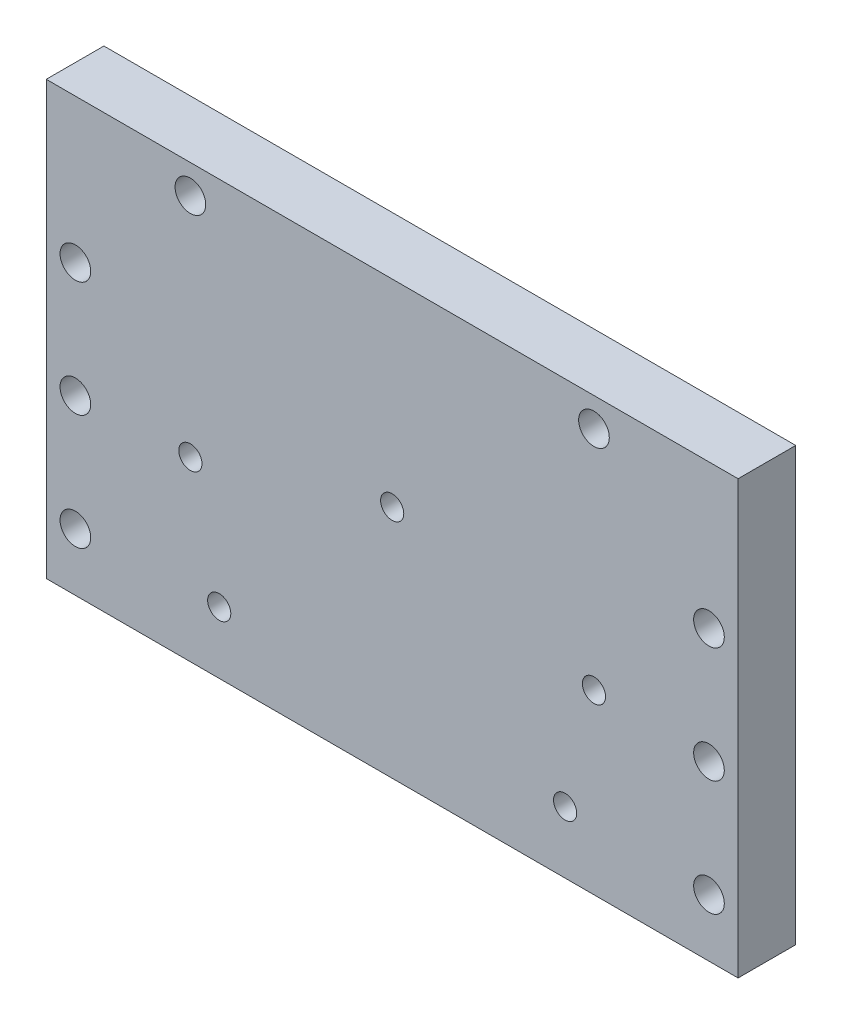
ISO-10303-21;
HEADER;
FILE_DESCRIPTION(('STEP AP214'),'2;1');
FILE_NAME('part.step','',(''),(''),'','','');
FILE_SCHEMA(('AUTOMOTIVE_DESIGN { 1 0 10303 214 1 1 1 1 }'));
ENDSEC;
DATA;
#1=APPLICATION_CONTEXT('core data for automotive mechanical design processes');
#2=APPLICATION_PROTOCOL_DEFINITION('international standard','automotive_design',2000,#1);
#3=PRODUCT_CONTEXT('',#1,'mechanical');
#4=PRODUCT('Part','Part','',(#3));
#5=PRODUCT_RELATED_PRODUCT_CATEGORY('part','',(#4));
#6=PRODUCT_DEFINITION_FORMATION('','',#4);
#7=PRODUCT_DEFINITION_CONTEXT('part definition',#1,'design');
#8=PRODUCT_DEFINITION('design','',#6,#7);
#9=PRODUCT_DEFINITION_SHAPE('','',#8);
#10=(LENGTH_UNIT() NAMED_UNIT(*) SI_UNIT(.MILLI.,.METRE.));
#11=(NAMED_UNIT(*) PLANE_ANGLE_UNIT() SI_UNIT($,.RADIAN.));
#12=(NAMED_UNIT(*) SI_UNIT($,.STERADIAN.) SOLID_ANGLE_UNIT());
#13=UNCERTAINTY_MEASURE_WITH_UNIT(LENGTH_MEASURE(1.E-05),#10,'distance_accuracy_value','');
#14=(GEOMETRIC_REPRESENTATION_CONTEXT(3) GLOBAL_UNCERTAINTY_ASSIGNED_CONTEXT((#13)) GLOBAL_UNIT_ASSIGNED_CONTEXT((#10,
#11,#12)) REPRESENTATION_CONTEXT('',''));
#15=CARTESIAN_POINT('',(0.,0.,0.));
#16=DIRECTION('',(0.,0.,1.));
#17=DIRECTION('',(1.,0.,0.));
#18=AXIS2_PLACEMENT_3D('',#15,#16,#17);
#19=CARTESIAN_POINT('',(76.2,47.625,6.35));
#20=DIRECTION('',(-1.,0.,0.));
#21=DIRECTION('',(0.,0.,1.));
#22=AXIS2_PLACEMENT_3D('',#19,#20,#21);
#23=PLANE('',#22);
#24=DIRECTION('',(0.,1.,0.));
#25=VECTOR('',#24,1.);
#26=CARTESIAN_POINT('',(76.2,47.625,-6.35));
#27=LINE('',#26,#25);
#28=CARTESIAN_POINT('',(76.2,-47.625,-6.35));
#29=VERTEX_POINT('',#28);
#30=CARTESIAN_POINT('',(76.2,47.625,-6.35));
#31=VERTEX_POINT('',#30);
#32=EDGE_CURVE('E104',#29,#31,#27,.T.);
#33=ORIENTED_EDGE('',*,*,#32,.T.);
#34=DIRECTION('',(0.,0.,-1.));
#35=VECTOR('',#34,1.);
#36=CARTESIAN_POINT('',(76.2,47.625,6.35));
#37=LINE('',#36,#35);
#38=CARTESIAN_POINT('',(76.2,47.625,6.35));
#39=VERTEX_POINT('',#38);
#40=EDGE_CURVE('E11',#39,#31,#37,.T.);
#41=ORIENTED_EDGE('',*,*,#40,.F.);
#42=DIRECTION('',(0.,1.,0.));
#43=VECTOR('',#42,1.);
#44=CARTESIAN_POINT('',(76.2,47.625,6.35));
#45=LINE('',#44,#43);
#46=CARTESIAN_POINT('',(76.2,-47.625,6.35));
#47=VERTEX_POINT('',#46);
#48=EDGE_CURVE('E92',#47,#39,#45,.T.);
#49=ORIENTED_EDGE('',*,*,#48,.F.);
#50=DIRECTION('',(0.,0.,-1.));
#51=VECTOR('',#50,1.);
#52=CARTESIAN_POINT('',(76.2,-47.625,6.35));
#53=LINE('',#52,#51);
#54=EDGE_CURVE('E100',#47,#29,#53,.T.);
#55=ORIENTED_EDGE('',*,*,#54,.T.);
#56=EDGE_LOOP('',(#33,#41,#49,#55));
#57=FACE_BOUND('',#56,.T.);
#58=ADVANCED_FACE('F41',(#57),#23,.F.);
#59=CARTESIAN_POINT('',(-76.2,47.625,6.35));
#60=DIRECTION('',(0.,-1.,0.));
#61=DIRECTION('',(0.,0.,-1.));
#62=AXIS2_PLACEMENT_3D('',#59,#60,#61);
#63=PLANE('',#62);
#64=DIRECTION('',(-1.,0.,0.));
#65=VECTOR('',#64,1.);
#66=CARTESIAN_POINT('',(-76.2,47.625,-6.35));
#67=LINE('',#66,#65);
#68=CARTESIAN_POINT('',(-76.2,47.625,-6.35));
#69=VERTEX_POINT('',#68);
#70=EDGE_CURVE('E96',#31,#69,#67,.T.);
#71=ORIENTED_EDGE('',*,*,#70,.T.);
#72=DIRECTION('',(0.,0.,-1.));
#73=VECTOR('',#72,1.);
#74=CARTESIAN_POINT('',(-76.2,47.625,6.35));
#75=LINE('',#74,#73);
#76=CARTESIAN_POINT('',(-76.2,47.625,6.35));
#77=VERTEX_POINT('',#76);
#78=EDGE_CURVE('E49',#77,#69,#75,.T.);
#79=ORIENTED_EDGE('',*,*,#78,.F.);
#80=DIRECTION('',(-1.,0.,0.));
#81=VECTOR('',#80,1.);
#82=CARTESIAN_POINT('',(-76.2,47.625,6.35));
#83=LINE('',#82,#81);
#84=EDGE_CURVE('E87',#39,#77,#83,.T.);
#85=ORIENTED_EDGE('',*,*,#84,.F.);
#86=ORIENTED_EDGE('',*,*,#40,.T.);
#87=EDGE_LOOP('',(#71,#79,#85,#86));
#88=FACE_BOUND('',#87,.T.);
#89=ADVANCED_FACE('F95',(#88),#63,.F.);
#90=CARTESIAN_POINT('',(-76.2,47.625,6.35));
#91=DIRECTION('',(1.,0.,0.));
#92=DIRECTION('',(0.,0.,-1.));
#93=AXIS2_PLACEMENT_3D('',#90,#91,#92);
#94=PLANE('',#93);
#95=DIRECTION('',(0.,-1.,0.));
#96=VECTOR('',#95,1.);
#97=CARTESIAN_POINT('',(-76.2,47.625,-6.35));
#98=LINE('',#97,#96);
#99=CARTESIAN_POINT('',(-76.2,-47.625,-6.35));
#100=VERTEX_POINT('',#99);
#101=EDGE_CURVE('E74',#69,#100,#98,.T.);
#102=ORIENTED_EDGE('',*,*,#101,.T.);
#103=DIRECTION('',(0.,0.,-1.));
#104=VECTOR('',#103,1.);
#105=CARTESIAN_POINT('',(-76.2,-47.625,6.35));
#106=LINE('',#105,#104);
#107=CARTESIAN_POINT('',(-76.2,-47.625,6.35));
#108=VERTEX_POINT('',#107);
#109=EDGE_CURVE('E97',#108,#100,#106,.T.);
#110=ORIENTED_EDGE('',*,*,#109,.F.);
#111=DIRECTION('',(0.,-1.,0.));
#112=VECTOR('',#111,1.);
#113=CARTESIAN_POINT('',(-76.2,47.625,6.35));
#114=LINE('',#113,#112);
#115=EDGE_CURVE('E90',#77,#108,#114,.T.);
#116=ORIENTED_EDGE('',*,*,#115,.F.);
#117=ORIENTED_EDGE('',*,*,#78,.T.);
#118=EDGE_LOOP('',(#102,#110,#116,#117));
#119=FACE_BOUND('',#118,.T.);
#120=ADVANCED_FACE('F98',(#119),#94,.F.);
#121=CARTESIAN_POINT('',(-76.2,-47.625,6.35));
#122=DIRECTION('',(0.,1.,0.));
#123=DIRECTION('',(0.,0.,1.));
#124=AXIS2_PLACEMENT_3D('',#121,#122,#123);
#125=PLANE('',#124);
#126=DIRECTION('',(1.,0.,0.));
#127=VECTOR('',#126,1.);
#128=CARTESIAN_POINT('',(-76.2,-47.625,-6.35));
#129=LINE('',#128,#127);
#130=EDGE_CURVE('E80',#100,#29,#129,.T.);
#131=ORIENTED_EDGE('',*,*,#130,.T.);
#132=ORIENTED_EDGE('',*,*,#54,.F.);
#133=DIRECTION('',(1.,0.,0.));
#134=VECTOR('',#133,1.);
#135=CARTESIAN_POINT('',(-76.2,-47.625,6.35));
#136=LINE('',#135,#134);
#137=EDGE_CURVE('E57',#108,#47,#136,.T.);
#138=ORIENTED_EDGE('',*,*,#137,.F.);
#139=ORIENTED_EDGE('',*,*,#109,.T.);
#140=EDGE_LOOP('',(#131,#132,#138,#139));
#141=FACE_BOUND('',#140,.T.);
#142=ADVANCED_FACE('F112',(#141),#125,.F.);
#143=CARTESIAN_POINT('',(0.,0.,6.35));
#144=DIRECTION('',(0.,0.,1.));
#145=DIRECTION('',(1.,0.,0.));
#146=AXIS2_PLACEMENT_3D('',#143,#144,#145);
#147=PLANE('',#146);
#148=CARTESIAN_POINT('',(-38.1,-33.9852,6.35));
#149=DIRECTION('',(0.,0.,1.));
#150=DIRECTION('',(1.,0.,0.));
#151=AXIS2_PLACEMENT_3D('',#148,#149,#150);
#152=CIRCLE('',#151,2.5527);
#153=CARTESIAN_POINT('',(-35.5473,-33.9852,6.35));
#154=VERTEX_POINT('',#153);
#155=EDGE_CURVE('E192',#154,#154,#152,.T.);
#156=ORIENTED_EDGE('',*,*,#155,.F.);
#157=EDGE_LOOP('',(#156));
#158=FACE_BOUND('',#157,.T.);
#159=CARTESIAN_POINT('',(38.1,-33.9852,6.35));
#160=DIRECTION('',(0.,0.,1.));
#161=DIRECTION('',(1.,0.,0.));
#162=AXIS2_PLACEMENT_3D('',#159,#160,#161);
#163=CIRCLE('',#162,2.5527);
#164=CARTESIAN_POINT('',(40.6527,-33.9852,6.35));
#165=VERTEX_POINT('',#164);
#166=EDGE_CURVE('E186',#165,#165,#163,.T.);
#167=ORIENTED_EDGE('',*,*,#166,.F.);
#168=EDGE_LOOP('',(#167));
#169=FACE_BOUND('',#168,.T.);
#170=CARTESIAN_POINT('',(-44.45,-8.58520000000003,6.35));
#171=DIRECTION('',(0.,0.,1.));
#172=DIRECTION('',(1.,0.,0.));
#173=AXIS2_PLACEMENT_3D('',#170,#171,#172);
#174=CIRCLE('',#173,2.5527);
#175=CARTESIAN_POINT('',(-41.8973,-8.58520000000003,6.35));
#176=VERTEX_POINT('',#175);
#177=EDGE_CURVE('E180',#176,#176,#174,.T.);
#178=ORIENTED_EDGE('',*,*,#177,.F.);
#179=EDGE_LOOP('',(#178));
#180=FACE_BOUND('',#179,.T.);
#181=CARTESIAN_POINT('',(44.45,-8.58520000000003,6.35));
#182=DIRECTION('',(0.,0.,1.));
#183=DIRECTION('',(1.,0.,0.));
#184=AXIS2_PLACEMENT_3D('',#181,#182,#183);
#185=CIRCLE('',#184,2.5527);
#186=CARTESIAN_POINT('',(47.0027,-8.58520000000003,6.35));
#187=VERTEX_POINT('',#186);
#188=EDGE_CURVE('E174',#187,#187,#185,.T.);
#189=ORIENTED_EDGE('',*,*,#188,.F.);
#190=EDGE_LOOP('',(#189));
#191=FACE_BOUND('',#190,.T.);
#192=CARTESIAN_POINT('',(0.,4.11479999999997,6.35));
#193=DIRECTION('',(0.,0.,1.));
#194=DIRECTION('',(1.,0.,0.));
#195=AXIS2_PLACEMENT_3D('',#192,#193,#194);
#196=CIRCLE('',#195,2.5527);
#197=CARTESIAN_POINT('',(2.5527,4.11479999999997,6.35));
#198=VERTEX_POINT('',#197);
#199=EDGE_CURVE('E168',#198,#198,#196,.T.);
#200=ORIENTED_EDGE('',*,*,#199,.F.);
#201=EDGE_LOOP('',(#200));
#202=FACE_BOUND('',#201,.T.);
#203=CARTESIAN_POINT('',(-44.45,41.275,6.35));
#204=DIRECTION('',(0.,0.,1.));
#205=DIRECTION('',(1.,0.,0.));
#206=AXIS2_PLACEMENT_3D('',#203,#204,#205);
#207=CIRCLE('',#206,3.37819999999999);
#208=CARTESIAN_POINT('',(-41.0718,41.275,6.35));
#209=VERTEX_POINT('',#208);
#210=EDGE_CURVE('E162',#209,#209,#207,.T.);
#211=ORIENTED_EDGE('',*,*,#210,.F.);
#212=EDGE_LOOP('',(#211));
#213=FACE_BOUND('',#212,.T.);
#214=CARTESIAN_POINT('',(44.45,41.275,6.35));
#215=DIRECTION('',(0.,0.,1.));
#216=DIRECTION('',(1.,0.,0.));
#217=AXIS2_PLACEMENT_3D('',#214,#215,#216);
#218=CIRCLE('',#217,3.37819999999999);
#219=CARTESIAN_POINT('',(47.8282,41.275,6.35));
#220=VERTEX_POINT('',#219);
#221=EDGE_CURVE('E156',#220,#220,#218,.T.);
#222=ORIENTED_EDGE('',*,*,#221,.F.);
#223=EDGE_LOOP('',(#222));
#224=FACE_BOUND('',#223,.T.);
#225=CARTESIAN_POINT('',(69.7850602677928,15.875,6.35));
#226=DIRECTION('',(0.,0.,1.));
#227=DIRECTION('',(1.,0.,0.));
#228=AXIS2_PLACEMENT_3D('',#225,#226,#227);
#229=CIRCLE('',#228,3.37819999999998);
#230=CARTESIAN_POINT('',(73.1632602677928,15.875,6.35));
#231=VERTEX_POINT('',#230);
#232=EDGE_CURVE('E150',#231,#231,#229,.T.);
#233=ORIENTED_EDGE('',*,*,#232,.F.);
#234=EDGE_LOOP('',(#233));
#235=FACE_BOUND('',#234,.T.);
#236=CARTESIAN_POINT('',(69.7850602677928,-9.52500000000001,6.35));
#237=DIRECTION('',(0.,0.,1.));
#238=DIRECTION('',(1.,0.,0.));
#239=AXIS2_PLACEMENT_3D('',#236,#237,#238);
#240=CIRCLE('',#239,3.37819999999998);
#241=CARTESIAN_POINT('',(73.1632602677928,-9.52500000000001,6.35));
#242=VERTEX_POINT('',#241);
#243=EDGE_CURVE('E144',#242,#242,#240,.T.);
#244=ORIENTED_EDGE('',*,*,#243,.F.);
#245=EDGE_LOOP('',(#244));
#246=FACE_BOUND('',#245,.T.);
#247=CARTESIAN_POINT('',(69.7850602677928,-34.925,6.35));
#248=DIRECTION('',(0.,0.,1.));
#249=DIRECTION('',(1.,0.,0.));
#250=AXIS2_PLACEMENT_3D('',#247,#248,#249);
#251=CIRCLE('',#250,3.37819999999998);
#252=CARTESIAN_POINT('',(73.1632602677928,-34.925,6.35));
#253=VERTEX_POINT('',#252);
#254=EDGE_CURVE('E138',#253,#253,#251,.T.);
#255=ORIENTED_EDGE('',*,*,#254,.F.);
#256=EDGE_LOOP('',(#255));
#257=FACE_BOUND('',#256,.T.);
#258=CARTESIAN_POINT('',(-69.7850602677927,15.875,6.35));
#259=DIRECTION('',(0.,0.,1.));
#260=DIRECTION('',(1.,0.,0.));
#261=AXIS2_PLACEMENT_3D('',#258,#259,#260);
#262=CIRCLE('',#261,3.37819999999998);
#263=CARTESIAN_POINT('',(-66.4068602677927,15.875,6.35));
#264=VERTEX_POINT('',#263);
#265=EDGE_CURVE('E132',#264,#264,#262,.T.);
#266=ORIENTED_EDGE('',*,*,#265,.F.);
#267=EDGE_LOOP('',(#266));
#268=FACE_BOUND('',#267,.T.);
#269=CARTESIAN_POINT('',(-69.7850602677927,-9.52500000000002,6.35));
#270=DIRECTION('',(0.,0.,1.));
#271=DIRECTION('',(1.,0.,0.));
#272=AXIS2_PLACEMENT_3D('',#269,#270,#271);
#273=CIRCLE('',#272,3.37819999999998);
#274=CARTESIAN_POINT('',(-66.4068602677927,-9.52500000000002,6.35));
#275=VERTEX_POINT('',#274);
#276=EDGE_CURVE('E126',#275,#275,#273,.T.);
#277=ORIENTED_EDGE('',*,*,#276,.F.);
#278=EDGE_LOOP('',(#277));
#279=FACE_BOUND('',#278,.T.);
#280=CARTESIAN_POINT('',(-69.7850602677927,-34.925,6.35));
#281=DIRECTION('',(0.,0.,1.));
#282=DIRECTION('',(1.,0.,0.));
#283=AXIS2_PLACEMENT_3D('',#280,#281,#282);
#284=CIRCLE('',#283,3.37819999999998);
#285=CARTESIAN_POINT('',(-66.4068602677927,-34.925,6.35));
#286=VERTEX_POINT('',#285);
#287=EDGE_CURVE('E120',#286,#286,#284,.T.);
#288=ORIENTED_EDGE('',*,*,#287,.F.);
#289=EDGE_LOOP('',(#288));
#290=FACE_BOUND('',#289,.T.);
#291=ORIENTED_EDGE('',*,*,#48,.T.);
#292=ORIENTED_EDGE('',*,*,#84,.T.);
#293=ORIENTED_EDGE('',*,*,#115,.T.);
#294=ORIENTED_EDGE('',*,*,#137,.T.);
#295=EDGE_LOOP('',(#291,#292,#293,#294));
#296=FACE_BOUND('',#295,.T.);
#297=ADVANCED_FACE('F88',(#158,#169,#180,#191,#202,#213,#224,#235,#246,#257,#268,#279,#290,
#296),#147,.T.);
#298=CARTESIAN_POINT('',(0.,0.,-6.35));
#299=DIRECTION('',(0.,0.,1.));
#300=DIRECTION('',(1.,0.,0.));
#301=AXIS2_PLACEMENT_3D('',#298,#299,#300);
#302=PLANE('',#301);
#303=CARTESIAN_POINT('',(-38.1,-33.9852,-6.35));
#304=DIRECTION('',(0.,0.,1.));
#305=DIRECTION('',(1.,0.,0.));
#306=AXIS2_PLACEMENT_3D('',#303,#304,#305);
#307=CIRCLE('',#306,2.5527);
#308=CARTESIAN_POINT('',(-35.5473,-33.9852,-6.35));
#309=VERTEX_POINT('',#308);
#310=EDGE_CURVE('E189',#309,#309,#307,.T.);
#311=ORIENTED_EDGE('',*,*,#310,.T.);
#312=EDGE_LOOP('',(#311));
#313=FACE_BOUND('',#312,.T.);
#314=CARTESIAN_POINT('',(38.1,-33.9852,-6.35));
#315=DIRECTION('',(0.,0.,1.));
#316=DIRECTION('',(1.,0.,0.));
#317=AXIS2_PLACEMENT_3D('',#314,#315,#316);
#318=CIRCLE('',#317,2.5527);
#319=CARTESIAN_POINT('',(40.6527,-33.9852,-6.35));
#320=VERTEX_POINT('',#319);
#321=EDGE_CURVE('E183',#320,#320,#318,.T.);
#322=ORIENTED_EDGE('',*,*,#321,.T.);
#323=EDGE_LOOP('',(#322));
#324=FACE_BOUND('',#323,.T.);
#325=CARTESIAN_POINT('',(-44.45,-8.58520000000003,-6.35));
#326=DIRECTION('',(0.,0.,1.));
#327=DIRECTION('',(1.,0.,0.));
#328=AXIS2_PLACEMENT_3D('',#325,#326,#327);
#329=CIRCLE('',#328,2.5527);
#330=CARTESIAN_POINT('',(-41.8973,-8.58520000000003,-6.35));
#331=VERTEX_POINT('',#330);
#332=EDGE_CURVE('E177',#331,#331,#329,.T.);
#333=ORIENTED_EDGE('',*,*,#332,.T.);
#334=EDGE_LOOP('',(#333));
#335=FACE_BOUND('',#334,.T.);
#336=CARTESIAN_POINT('',(44.45,-8.58520000000003,-6.35));
#337=DIRECTION('',(0.,0.,1.));
#338=DIRECTION('',(1.,0.,0.));
#339=AXIS2_PLACEMENT_3D('',#336,#337,#338);
#340=CIRCLE('',#339,2.5527);
#341=CARTESIAN_POINT('',(47.0027,-8.58520000000003,-6.35));
#342=VERTEX_POINT('',#341);
#343=EDGE_CURVE('E171',#342,#342,#340,.T.);
#344=ORIENTED_EDGE('',*,*,#343,.T.);
#345=EDGE_LOOP('',(#344));
#346=FACE_BOUND('',#345,.T.);
#347=CARTESIAN_POINT('',(0.,4.11479999999997,-6.35));
#348=DIRECTION('',(0.,0.,1.));
#349=DIRECTION('',(1.,0.,0.));
#350=AXIS2_PLACEMENT_3D('',#347,#348,#349);
#351=CIRCLE('',#350,2.5527);
#352=CARTESIAN_POINT('',(2.5527,4.11479999999997,-6.35));
#353=VERTEX_POINT('',#352);
#354=EDGE_CURVE('E165',#353,#353,#351,.T.);
#355=ORIENTED_EDGE('',*,*,#354,.T.);
#356=EDGE_LOOP('',(#355));
#357=FACE_BOUND('',#356,.T.);
#358=CARTESIAN_POINT('',(-44.45,41.275,-6.35));
#359=DIRECTION('',(0.,0.,1.));
#360=DIRECTION('',(1.,0.,0.));
#361=AXIS2_PLACEMENT_3D('',#358,#359,#360);
#362=CIRCLE('',#361,3.3782);
#363=CARTESIAN_POINT('',(-41.0718,41.275,-6.35));
#364=VERTEX_POINT('',#363);
#365=EDGE_CURVE('E159',#364,#364,#362,.T.);
#366=ORIENTED_EDGE('',*,*,#365,.T.);
#367=EDGE_LOOP('',(#366));
#368=FACE_BOUND('',#367,.T.);
#369=CARTESIAN_POINT('',(44.45,41.275,-6.35));
#370=DIRECTION('',(0.,0.,1.));
#371=DIRECTION('',(1.,0.,0.));
#372=AXIS2_PLACEMENT_3D('',#369,#370,#371);
#373=CIRCLE('',#372,3.3782);
#374=CARTESIAN_POINT('',(47.8282,41.275,-6.35));
#375=VERTEX_POINT('',#374);
#376=EDGE_CURVE('E153',#375,#375,#373,.T.);
#377=ORIENTED_EDGE('',*,*,#376,.T.);
#378=EDGE_LOOP('',(#377));
#379=FACE_BOUND('',#378,.T.);
#380=CARTESIAN_POINT('',(69.7850602677928,15.875,-6.35));
#381=DIRECTION('',(0.,0.,1.));
#382=DIRECTION('',(1.,0.,0.));
#383=AXIS2_PLACEMENT_3D('',#380,#381,#382);
#384=CIRCLE('',#383,3.3782);
#385=CARTESIAN_POINT('',(73.1632602677928,15.875,-6.35));
#386=VERTEX_POINT('',#385);
#387=EDGE_CURVE('E147',#386,#386,#384,.T.);
#388=ORIENTED_EDGE('',*,*,#387,.T.);
#389=EDGE_LOOP('',(#388));
#390=FACE_BOUND('',#389,.T.);
#391=CARTESIAN_POINT('',(69.7850602677928,-9.52500000000001,-6.35));
#392=DIRECTION('',(0.,0.,1.));
#393=DIRECTION('',(1.,0.,0.));
#394=AXIS2_PLACEMENT_3D('',#391,#392,#393);
#395=CIRCLE('',#394,3.3782);
#396=CARTESIAN_POINT('',(73.1632602677928,-9.52500000000001,-6.35));
#397=VERTEX_POINT('',#396);
#398=EDGE_CURVE('E141',#397,#397,#395,.T.);
#399=ORIENTED_EDGE('',*,*,#398,.T.);
#400=EDGE_LOOP('',(#399));
#401=FACE_BOUND('',#400,.T.);
#402=CARTESIAN_POINT('',(69.7850602677928,-34.925,-6.35));
#403=DIRECTION('',(0.,0.,1.));
#404=DIRECTION('',(1.,0.,0.));
#405=AXIS2_PLACEMENT_3D('',#402,#403,#404);
#406=CIRCLE('',#405,3.3782);
#407=CARTESIAN_POINT('',(73.1632602677928,-34.925,-6.35));
#408=VERTEX_POINT('',#407);
#409=EDGE_CURVE('E135',#408,#408,#406,.T.);
#410=ORIENTED_EDGE('',*,*,#409,.T.);
#411=EDGE_LOOP('',(#410));
#412=FACE_BOUND('',#411,.T.);
#413=CARTESIAN_POINT('',(-69.7850602677927,15.875,-6.35));
#414=DIRECTION('',(0.,0.,1.));
#415=DIRECTION('',(1.,0.,0.));
#416=AXIS2_PLACEMENT_3D('',#413,#414,#415);
#417=CIRCLE('',#416,3.3782);
#418=CARTESIAN_POINT('',(-66.4068602677927,15.875,-6.35));
#419=VERTEX_POINT('',#418);
#420=EDGE_CURVE('E129',#419,#419,#417,.T.);
#421=ORIENTED_EDGE('',*,*,#420,.T.);
#422=EDGE_LOOP('',(#421));
#423=FACE_BOUND('',#422,.T.);
#424=CARTESIAN_POINT('',(-69.7850602677927,-9.52500000000002,-6.35));
#425=DIRECTION('',(0.,0.,1.));
#426=DIRECTION('',(1.,0.,0.));
#427=AXIS2_PLACEMENT_3D('',#424,#425,#426);
#428=CIRCLE('',#427,3.3782);
#429=CARTESIAN_POINT('',(-66.4068602677927,-9.52500000000002,-6.35));
#430=VERTEX_POINT('',#429);
#431=EDGE_CURVE('E123',#430,#430,#428,.T.);
#432=ORIENTED_EDGE('',*,*,#431,.T.);
#433=EDGE_LOOP('',(#432));
#434=FACE_BOUND('',#433,.T.);
#435=CARTESIAN_POINT('',(-69.7850602677927,-34.925,-6.35));
#436=DIRECTION('',(0.,0.,1.));
#437=DIRECTION('',(1.,0.,0.));
#438=AXIS2_PLACEMENT_3D('',#435,#436,#437);
#439=CIRCLE('',#438,3.3782);
#440=CARTESIAN_POINT('',(-66.4068602677927,-34.925,-6.35));
#441=VERTEX_POINT('',#440);
#442=EDGE_CURVE('E107',#441,#441,#439,.T.);
#443=ORIENTED_EDGE('',*,*,#442,.T.);
#444=EDGE_LOOP('',(#443));
#445=FACE_BOUND('',#444,.T.);
#446=ORIENTED_EDGE('',*,*,#32,.F.);
#447=ORIENTED_EDGE('',*,*,#130,.F.);
#448=ORIENTED_EDGE('',*,*,#101,.F.);
#449=ORIENTED_EDGE('',*,*,#70,.F.);
#450=EDGE_LOOP('',(#446,#447,#448,#449));
#451=FACE_BOUND('',#450,.T.);
#452=ADVANCED_FACE('F115',(#313,#324,#335,#346,#357,#368,#379,#390,#401,#412,#423,#434,#445,
#451),#302,.F.);
#453=CARTESIAN_POINT('',(-69.7850602677927,-34.925,6.35));
#454=DIRECTION('',(0.,0.,1.));
#455=DIRECTION('',(1.,0.,0.));
#456=AXIS2_PLACEMENT_3D('',#453,#454,#455);
#457=CYLINDRICAL_SURFACE('',#456,3.37819999999999);
#458=ORIENTED_EDGE('',*,*,#442,.F.);
#459=EDGE_LOOP('',(#458));
#460=FACE_BOUND('',#459,.T.);
#461=ORIENTED_EDGE('',*,*,#287,.T.);
#462=EDGE_LOOP('',(#461));
#463=FACE_BOUND('',#462,.T.);
#464=ADVANCED_FACE('F225',(#460,#463),#457,.F.);
#465=CARTESIAN_POINT('',(-69.7850602677927,-9.52500000000002,6.35));
#466=DIRECTION('',(0.,0.,1.));
#467=DIRECTION('',(1.,0.,0.));
#468=AXIS2_PLACEMENT_3D('',#465,#466,#467);
#469=CYLINDRICAL_SURFACE('',#468,3.37819999999999);
#470=ORIENTED_EDGE('',*,*,#431,.F.);
#471=EDGE_LOOP('',(#470));
#472=FACE_BOUND('',#471,.T.);
#473=ORIENTED_EDGE('',*,*,#276,.T.);
#474=EDGE_LOOP('',(#473));
#475=FACE_BOUND('',#474,.T.);
#476=ADVANCED_FACE('F227',(#472,#475),#469,.F.);
#477=CARTESIAN_POINT('',(-69.7850602677927,15.875,6.35));
#478=DIRECTION('',(0.,0.,1.));
#479=DIRECTION('',(1.,0.,0.));
#480=AXIS2_PLACEMENT_3D('',#477,#478,#479);
#481=CYLINDRICAL_SURFACE('',#480,3.37819999999999);
#482=ORIENTED_EDGE('',*,*,#420,.F.);
#483=EDGE_LOOP('',(#482));
#484=FACE_BOUND('',#483,.T.);
#485=ORIENTED_EDGE('',*,*,#265,.T.);
#486=EDGE_LOOP('',(#485));
#487=FACE_BOUND('',#486,.T.);
#488=ADVANCED_FACE('F234',(#484,#487),#481,.F.);
#489=CARTESIAN_POINT('',(69.7850602677928,-34.925,6.35));
#490=DIRECTION('',(0.,0.,1.));
#491=DIRECTION('',(1.,0.,0.));
#492=AXIS2_PLACEMENT_3D('',#489,#490,#491);
#493=CYLINDRICAL_SURFACE('',#492,3.37819999999999);
#494=ORIENTED_EDGE('',*,*,#409,.F.);
#495=EDGE_LOOP('',(#494));
#496=FACE_BOUND('',#495,.T.);
#497=ORIENTED_EDGE('',*,*,#254,.T.);
#498=EDGE_LOOP('',(#497));
#499=FACE_BOUND('',#498,.T.);
#500=ADVANCED_FACE('F283',(#496,#499),#493,.F.);
#501=CARTESIAN_POINT('',(69.7850602677928,-9.52500000000001,6.35));
#502=DIRECTION('',(0.,0.,1.));
#503=DIRECTION('',(1.,0.,0.));
#504=AXIS2_PLACEMENT_3D('',#501,#502,#503);
#505=CYLINDRICAL_SURFACE('',#504,3.37819999999999);
#506=ORIENTED_EDGE('',*,*,#398,.F.);
#507=EDGE_LOOP('',(#506));
#508=FACE_BOUND('',#507,.T.);
#509=ORIENTED_EDGE('',*,*,#243,.T.);
#510=EDGE_LOOP('',(#509));
#511=FACE_BOUND('',#510,.T.);
#512=ADVANCED_FACE('F291',(#508,#511),#505,.F.);
#513=CARTESIAN_POINT('',(69.7850602677928,15.875,6.35));
#514=DIRECTION('',(0.,0.,1.));
#515=DIRECTION('',(1.,0.,0.));
#516=AXIS2_PLACEMENT_3D('',#513,#514,#515);
#517=CYLINDRICAL_SURFACE('',#516,3.37819999999999);
#518=ORIENTED_EDGE('',*,*,#387,.F.);
#519=EDGE_LOOP('',(#518));
#520=FACE_BOUND('',#519,.T.);
#521=ORIENTED_EDGE('',*,*,#232,.T.);
#522=EDGE_LOOP('',(#521));
#523=FACE_BOUND('',#522,.T.);
#524=ADVANCED_FACE('F299',(#520,#523),#517,.F.);
#525=CARTESIAN_POINT('',(44.45,41.275,6.35));
#526=DIRECTION('',(0.,0.,1.));
#527=DIRECTION('',(1.,0.,0.));
#528=AXIS2_PLACEMENT_3D('',#525,#526,#527);
#529=CYLINDRICAL_SURFACE('',#528,3.37819999999999);
#530=ORIENTED_EDGE('',*,*,#376,.F.);
#531=EDGE_LOOP('',(#530));
#532=FACE_BOUND('',#531,.T.);
#533=ORIENTED_EDGE('',*,*,#221,.T.);
#534=EDGE_LOOP('',(#533));
#535=FACE_BOUND('',#534,.T.);
#536=ADVANCED_FACE('F307',(#532,#535),#529,.F.);
#537=CARTESIAN_POINT('',(-44.45,41.275,6.35));
#538=DIRECTION('',(0.,0.,1.));
#539=DIRECTION('',(1.,0.,0.));
#540=AXIS2_PLACEMENT_3D('',#537,#538,#539);
#541=CYLINDRICAL_SURFACE('',#540,3.37819999999999);
#542=ORIENTED_EDGE('',*,*,#365,.F.);
#543=EDGE_LOOP('',(#542));
#544=FACE_BOUND('',#543,.T.);
#545=ORIENTED_EDGE('',*,*,#210,.T.);
#546=EDGE_LOOP('',(#545));
#547=FACE_BOUND('',#546,.T.);
#548=ADVANCED_FACE('F315',(#544,#547),#541,.F.);
#549=CARTESIAN_POINT('',(0.,4.11479999999997,6.35));
#550=DIRECTION('',(0.,0.,1.));
#551=DIRECTION('',(1.,0.,0.));
#552=AXIS2_PLACEMENT_3D('',#549,#550,#551);
#553=CYLINDRICAL_SURFACE('',#552,2.5527);
#554=ORIENTED_EDGE('',*,*,#354,.F.);
#555=EDGE_LOOP('',(#554));
#556=FACE_BOUND('',#555,.T.);
#557=ORIENTED_EDGE('',*,*,#199,.T.);
#558=EDGE_LOOP('',(#557));
#559=FACE_BOUND('',#558,.T.);
#560=ADVANCED_FACE('F322',(#556,#559),#553,.F.);
#561=CARTESIAN_POINT('',(44.45,-8.58520000000003,6.35));
#562=DIRECTION('',(0.,0.,1.));
#563=DIRECTION('',(1.,0.,0.));
#564=AXIS2_PLACEMENT_3D('',#561,#562,#563);
#565=CYLINDRICAL_SURFACE('',#564,2.5527);
#566=ORIENTED_EDGE('',*,*,#343,.F.);
#567=EDGE_LOOP('',(#566));
#568=FACE_BOUND('',#567,.T.);
#569=ORIENTED_EDGE('',*,*,#188,.T.);
#570=EDGE_LOOP('',(#569));
#571=FACE_BOUND('',#570,.T.);
#572=ADVANCED_FACE('F329',(#568,#571),#565,.F.);
#573=CARTESIAN_POINT('',(-44.45,-8.58520000000003,6.35));
#574=DIRECTION('',(0.,0.,1.));
#575=DIRECTION('',(1.,0.,0.));
#576=AXIS2_PLACEMENT_3D('',#573,#574,#575);
#577=CYLINDRICAL_SURFACE('',#576,2.5527);
#578=ORIENTED_EDGE('',*,*,#332,.F.);
#579=EDGE_LOOP('',(#578));
#580=FACE_BOUND('',#579,.T.);
#581=ORIENTED_EDGE('',*,*,#177,.T.);
#582=EDGE_LOOP('',(#581));
#583=FACE_BOUND('',#582,.T.);
#584=ADVANCED_FACE('F337',(#580,#583),#577,.F.);
#585=CARTESIAN_POINT('',(38.1,-33.9852,6.35));
#586=DIRECTION('',(0.,0.,1.));
#587=DIRECTION('',(1.,0.,0.));
#588=AXIS2_PLACEMENT_3D('',#585,#586,#587);
#589=CYLINDRICAL_SURFACE('',#588,2.5527);
#590=ORIENTED_EDGE('',*,*,#321,.F.);
#591=EDGE_LOOP('',(#590));
#592=FACE_BOUND('',#591,.T.);
#593=ORIENTED_EDGE('',*,*,#166,.T.);
#594=EDGE_LOOP('',(#593));
#595=FACE_BOUND('',#594,.T.);
#596=ADVANCED_FACE('F345',(#592,#595),#589,.F.);
#597=CARTESIAN_POINT('',(-38.1,-33.9852,6.35));
#598=DIRECTION('',(0.,0.,1.));
#599=DIRECTION('',(1.,0.,0.));
#600=AXIS2_PLACEMENT_3D('',#597,#598,#599);
#601=CYLINDRICAL_SURFACE('',#600,2.5527);
#602=ORIENTED_EDGE('',*,*,#310,.F.);
#603=EDGE_LOOP('',(#602));
#604=FACE_BOUND('',#603,.T.);
#605=ORIENTED_EDGE('',*,*,#155,.T.);
#606=EDGE_LOOP('',(#605));
#607=FACE_BOUND('',#606,.T.);
#608=ADVANCED_FACE('F196',(#604,#607),#601,.F.);
#609=CLOSED_SHELL('',(#58,#89,#120,#142,#297,#452,#464,#476,#488,#500,#512,#524,#536,#548,#560,
#572,#584,#596,#608));
#610=MANIFOLD_SOLID_BREP('B2',#609);
#611=ADVANCED_BREP_SHAPE_REPRESENTATION('',(#18,#610),#14);
#612=SHAPE_DEFINITION_REPRESENTATION(#9,#611);
ENDSEC;
END-ISO-10303-21;
